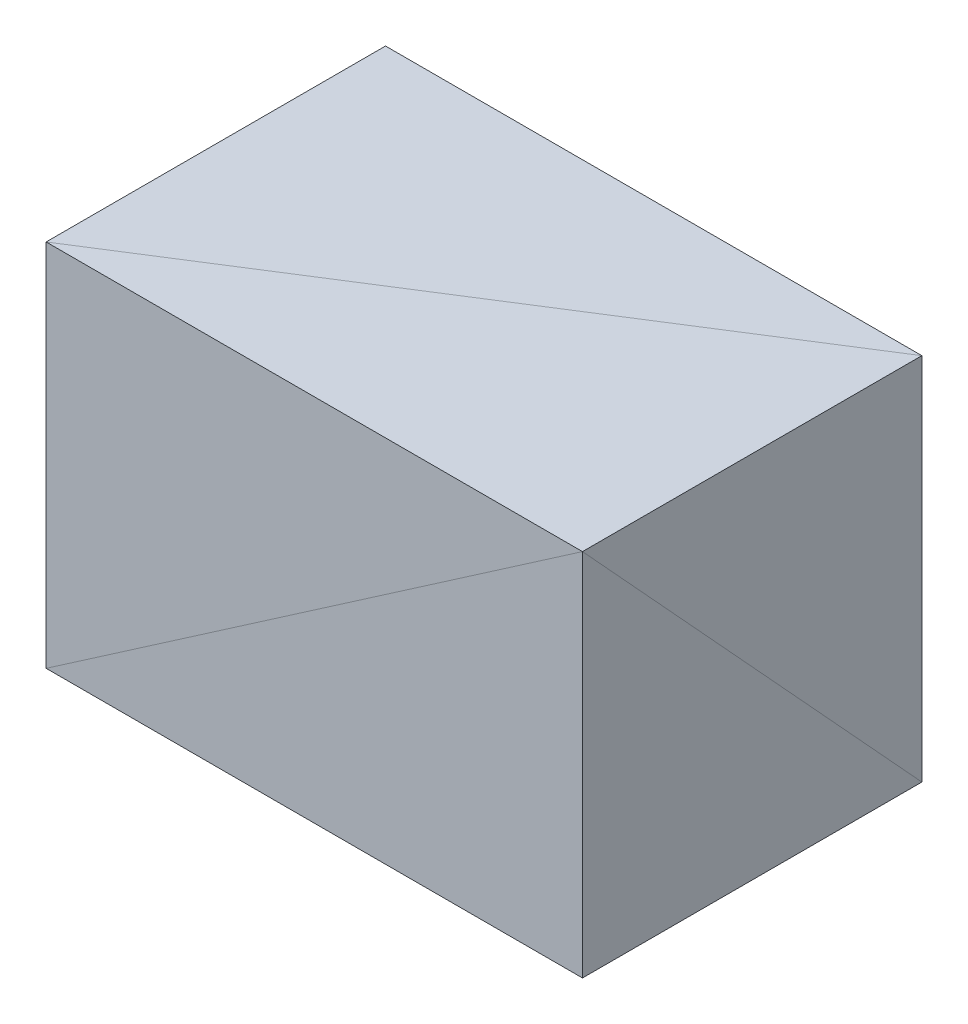
ISO-10303-21;
HEADER;
FILE_DESCRIPTION(('STEP AP214'),'2;1');
FILE_NAME('part.step','',(''),(''),'','','');
FILE_SCHEMA(('AUTOMOTIVE_DESIGN { 1 0 10303 214 1 1 1 1 }'));
ENDSEC;
DATA;
#1=APPLICATION_CONTEXT('core data for automotive mechanical design processes');
#2=APPLICATION_PROTOCOL_DEFINITION('international standard','automotive_design',2000,#1);
#3=PRODUCT_CONTEXT('',#1,'mechanical');
#4=PRODUCT('Part','Part','',(#3));
#5=PRODUCT_RELATED_PRODUCT_CATEGORY('part','',(#4));
#6=PRODUCT_DEFINITION_FORMATION('','',#4);
#7=PRODUCT_DEFINITION_CONTEXT('part definition',#1,'design');
#8=PRODUCT_DEFINITION('design','',#6,#7);
#9=PRODUCT_DEFINITION_SHAPE('','',#8);
#10=(LENGTH_UNIT() NAMED_UNIT(*) SI_UNIT(.MILLI.,.METRE.));
#11=(NAMED_UNIT(*) PLANE_ANGLE_UNIT() SI_UNIT($,.RADIAN.));
#12=(NAMED_UNIT(*) SI_UNIT($,.STERADIAN.) SOLID_ANGLE_UNIT());
#13=UNCERTAINTY_MEASURE_WITH_UNIT(LENGTH_MEASURE(1.E-05),#10,'distance_accuracy_value','');
#14=(GEOMETRIC_REPRESENTATION_CONTEXT(3) GLOBAL_UNCERTAINTY_ASSIGNED_CONTEXT((#13)) GLOBAL_UNIT_ASSIGNED_CONTEXT((#10,
#11,#12)) REPRESENTATION_CONTEXT('',''));
#15=CARTESIAN_POINT('',(0.,0.,0.));
#16=DIRECTION('',(0.,0.,1.));
#17=DIRECTION('',(1.,0.,0.));
#18=AXIS2_PLACEMENT_3D('',#15,#16,#17);
#19=CARTESIAN_POINT('',(-3.633766810099,1.079666694005,4.90299987793));
#20=DIRECTION('',(0.,0.,-1.));
#21=DIRECTION('',(0.,-1.,0.));
#22=AXIS2_PLACEMENT_3D('',#19,#20,#21);
#23=PLANE('',#22);
#24=CARTESIAN_POINT('',(4.113233248393,6.413333257039,4.90299987793));
#25=DIRECTION('',(-1.,0.,0.));
#26=VECTOR('',#25,1.);
#27=LINE('',#24,#26);
#28=CARTESIAN_POINT('',(4.11323324839278,6.41341654459648,4.90299987792983));
#29=VERTEX_POINT('',#28);
#30=CARTESIAN_POINT('',(-3.63376681009914,6.413416544596,4.90299987792978));
#31=VERTEX_POINT('',#30);
#32=EDGE_CURVE('E61',#29,#31,#27,.T.);
#33=ORIENTED_EDGE('',*,*,#32,.T.);
#34=CARTESIAN_POINT('',(-3.633766810099,6.413333257039,4.90299987793));
#35=DIRECTION('',(0.,-1.,0.));
#36=VECTOR('',#35,1.);
#37=LINE('',#34,#36);
#38=CARTESIAN_POINT('',(-3.63376681009878,1.07958336671153,4.90299987792983));
#39=VERTEX_POINT('',#38);
#40=EDGE_CURVE('E65',#31,#39,#37,.T.);
#41=ORIENTED_EDGE('',*,*,#40,.T.);
#42=CARTESIAN_POINT('',(-3.633766810099,1.079666694005,4.90299987793));
#43=DIRECTION('',(0.823664315672861,0.567077679940904,0.));
#44=VECTOR('',#43,1.);
#45=LINE('',#42,#44);
#46=EDGE_CURVE('E58',#39,#29,#45,.T.);
#47=ORIENTED_EDGE('',*,*,#46,.T.);
#48=EDGE_LOOP('',(#33,#41,#47));
#49=FACE_BOUND('',#48,.T.);
#50=ADVANCED_FACE('F16',(#49),#23,.F.);
#51=CARTESIAN_POINT('',(-3.633766810099,1.079666694005,4.90299987793));
#52=DIRECTION('',(0.,0.,-1.));
#53=DIRECTION('',(0.,-1.,0.));
#54=AXIS2_PLACEMENT_3D('',#51,#52,#53);
#55=PLANE('',#54);
#56=CARTESIAN_POINT('',(4.113233248393,1.079666694005,4.90299987793));
#57=DIRECTION('',(0.,1.,0.));
#58=VECTOR('',#57,1.);
#59=LINE('',#56,#58);
#60=CARTESIAN_POINT('',(4.11323324839314,1.079583366712,4.90299987792978));
#61=VERTEX_POINT('',#60);
#62=EDGE_CURVE('E71',#61,#29,#59,.T.);
#63=ORIENTED_EDGE('',*,*,#62,.T.);
#64=ORIENTED_EDGE('',*,*,#46,.F.);
#65=CARTESIAN_POINT('',(-3.633766810099,1.079666694005,4.90299987793));
#66=DIRECTION('',(1.,0.,0.));
#67=VECTOR('',#66,1.);
#68=LINE('',#65,#67);
#69=EDGE_CURVE('E77',#39,#61,#68,.T.);
#70=ORIENTED_EDGE('',*,*,#69,.T.);
#71=EDGE_LOOP('',(#63,#64,#70));
#72=FACE_BOUND('',#71,.T.);
#73=ADVANCED_FACE('F76',(#72),#55,.F.);
#74=CARTESIAN_POINT('',(4.113233248393,1.079500039419,4.90299987793));
#75=DIRECTION('',(-1.,0.,0.));
#76=DIRECTION('',(0.,0.,1.));
#77=AXIS2_PLACEMENT_3D('',#74,#75,#76);
#78=PLANE('',#77);
#79=CARTESIAN_POINT('',(4.113233248393,1.079500039419,0.00100000000869023));
#80=DIRECTION('',(0.,0.736294058048826,0.67666170283384));
#81=VECTOR('',#80,1.);
#82=LINE('',#79,#81);
#83=CARTESIAN_POINT('',(4.113233248393,1.07958336671184,0.00100000000886337));
#84=VERTEX_POINT('',#83);
#85=EDGE_CURVE('E86',#84,#29,#82,.T.);
#86=ORIENTED_EDGE('',*,*,#85,.T.);
#87=ORIENTED_EDGE('',*,*,#62,.F.);
#88=CARTESIAN_POINT('',(4.113233248393,1.079500039419,4.90299987793));
#89=DIRECTION('',(0.,0.,-1.));
#90=VECTOR('',#89,1.);
#91=LINE('',#88,#90);
#92=EDGE_CURVE('E89',#61,#84,#91,.T.);
#93=ORIENTED_EDGE('',*,*,#92,.T.);
#94=EDGE_LOOP('',(#86,#87,#93));
#95=FACE_BOUND('',#94,.T.);
#96=ADVANCED_FACE('F88',(#95),#78,.F.);
#97=CARTESIAN_POINT('',(4.113233248393,6.413499832153,4.90299987793));
#98=DIRECTION('',(0.,-1.,0.));
#99=DIRECTION('',(0.,0.,-1.));
#100=AXIS2_PLACEMENT_3D('',#97,#98,#99);
#101=PLANE('',#100);
#102=CARTESIAN_POINT('',(4.113233248393,6.413499832153,0.00100000000869023));
#103=DIRECTION('',(-0.845037604070773,0.,0.534706880174856));
#104=VECTOR('',#103,1.);
#105=LINE('',#102,#104);
#106=CARTESIAN_POINT('',(4.11323324839293,6.41341654459631,0.00100000000891432));
#107=VERTEX_POINT('',#106);
#108=EDGE_CURVE('E105',#107,#31,#105,.T.);
#109=ORIENTED_EDGE('',*,*,#108,.T.);
#110=ORIENTED_EDGE('',*,*,#32,.F.);
#111=CARTESIAN_POINT('',(4.113233248393,6.413499832153,4.90299987793));
#112=DIRECTION('',(0.,0.,-1.));
#113=VECTOR('',#112,1.);
#114=LINE('',#111,#113);
#115=EDGE_CURVE('E97',#29,#107,#114,.T.);
#116=ORIENTED_EDGE('',*,*,#115,.T.);
#117=EDGE_LOOP('',(#109,#110,#116));
#118=FACE_BOUND('',#117,.T.);
#119=ADVANCED_FACE('F102',(#118),#101,.F.);
#120=CARTESIAN_POINT('',(-3.633766810099,6.413499832153,4.90299987793));
#121=DIRECTION('',(1.,0.,0.));
#122=DIRECTION('',(0.,1.,0.));
#123=AXIS2_PLACEMENT_3D('',#120,#121,#122);
#124=PLANE('',#123);
#125=CARTESIAN_POINT('',(-3.633766810099,6.413499832153,0.00100000000869023));
#126=DIRECTION('',(0.,-0.736294058048826,0.67666170283384));
#127=VECTOR('',#126,1.);
#128=LINE('',#125,#127);
#129=CARTESIAN_POINT('',(-3.633766810099,6.41341654459616,0.00100000000886337));
#130=VERTEX_POINT('',#129);
#131=EDGE_CURVE('E214',#130,#39,#128,.T.);
#132=ORIENTED_EDGE('',*,*,#131,.T.);
#133=ORIENTED_EDGE('',*,*,#40,.F.);
#134=CARTESIAN_POINT('',(-3.633766810099,6.413499832153,4.90299987793));
#135=DIRECTION('',(0.,0.,-1.));
#136=VECTOR('',#135,1.);
#137=LINE('',#134,#136);
#138=EDGE_CURVE('E204',#31,#130,#137,.T.);
#139=ORIENTED_EDGE('',*,*,#138,.T.);
#140=EDGE_LOOP('',(#132,#133,#139));
#141=FACE_BOUND('',#140,.T.);
#142=ADVANCED_FACE('F183',(#141),#124,.F.);
#143=CARTESIAN_POINT('',(-3.633766810099,1.079500039419,4.90299987793));
#144=DIRECTION('',(0.,1.,0.));
#145=DIRECTION('',(1.,0.,0.));
#146=AXIS2_PLACEMENT_3D('',#143,#144,#145);
#147=PLANE('',#146);
#148=CARTESIAN_POINT('',(-3.633766810099,1.079500039419,0.00100000000869023));
#149=DIRECTION('',(0.845037604070773,0.,0.534706880174856));
#150=VECTOR('',#149,1.);
#151=LINE('',#148,#150);
#152=CARTESIAN_POINT('',(-3.63376681009892,1.07958336671168,0.00100000000891432));
#153=VERTEX_POINT('',#152);
#154=EDGE_CURVE('E116',#153,#61,#151,.T.);
#155=ORIENTED_EDGE('',*,*,#154,.T.);
#156=ORIENTED_EDGE('',*,*,#69,.F.);
#157=CARTESIAN_POINT('',(-3.633766810099,1.079500039419,4.90299987793));
#158=DIRECTION('',(0.,0.,-1.));
#159=VECTOR('',#158,1.);
#160=LINE('',#157,#159);
#161=EDGE_CURVE('E36',#39,#153,#160,.T.);
#162=ORIENTED_EDGE('',*,*,#161,.T.);
#163=EDGE_LOOP('',(#155,#156,#162));
#164=FACE_BOUND('',#163,.T.);
#165=ADVANCED_FACE('F135',(#164),#147,.F.);
#166=CARTESIAN_POINT('',(4.113233248393,1.079500039419,0.001000000008692));
#167=DIRECTION('',(-1.,0.,0.));
#168=DIRECTION('',(0.,0.,1.));
#169=AXIS2_PLACEMENT_3D('',#166,#167,#168);
#170=PLANE('',#169);
#171=ORIENTED_EDGE('',*,*,#115,.F.);
#172=ORIENTED_EDGE('',*,*,#85,.F.);
#173=CARTESIAN_POINT('',(4.113233248393,1.079500039419,0.001000000008692));
#174=DIRECTION('',(0.,1.,0.));
#175=VECTOR('',#174,1.);
#176=LINE('',#173,#175);
#177=EDGE_CURVE('E113',#84,#107,#176,.T.);
#178=ORIENTED_EDGE('',*,*,#177,.T.);
#179=EDGE_LOOP('',(#171,#172,#178));
#180=FACE_BOUND('',#179,.T.);
#181=ADVANCED_FACE('F111',(#180),#170,.F.);
#182=CARTESIAN_POINT('',(-3.633766810099,1.079500039419,0.001000000008692));
#183=DIRECTION('',(0.,1.,0.));
#184=DIRECTION('',(1.,0.,0.));
#185=AXIS2_PLACEMENT_3D('',#182,#183,#184);
#186=PLANE('',#185);
#187=ORIENTED_EDGE('',*,*,#92,.F.);
#188=ORIENTED_EDGE('',*,*,#154,.F.);
#189=CARTESIAN_POINT('',(-3.633766810099,1.079500039419,0.001000000008692));
#190=DIRECTION('',(1.,0.,0.));
#191=VECTOR('',#190,1.);
#192=LINE('',#189,#191);
#193=EDGE_CURVE('E228',#153,#84,#192,.T.);
#194=ORIENTED_EDGE('',*,*,#193,.T.);
#195=EDGE_LOOP('',(#187,#188,#194));
#196=FACE_BOUND('',#195,.T.);
#197=ADVANCED_FACE('F134',(#196),#186,.F.);
#198=CARTESIAN_POINT('',(4.113233248393,6.413499832153,0.001000000008692));
#199=DIRECTION('',(0.,-1.,0.));
#200=DIRECTION('',(0.,0.,-1.));
#201=AXIS2_PLACEMENT_3D('',#198,#199,#200);
#202=PLANE('',#201);
#203=ORIENTED_EDGE('',*,*,#138,.F.);
#204=ORIENTED_EDGE('',*,*,#108,.F.);
#205=CARTESIAN_POINT('',(4.113233248393,6.413499832153,0.001000000008692));
#206=DIRECTION('',(-1.,0.,0.));
#207=VECTOR('',#206,1.);
#208=LINE('',#205,#207);
#209=EDGE_CURVE('E219',#107,#130,#208,.T.);
#210=ORIENTED_EDGE('',*,*,#209,.T.);
#211=EDGE_LOOP('',(#203,#204,#210));
#212=FACE_BOUND('',#211,.T.);
#213=ADVANCED_FACE('F221',(#212),#202,.F.);
#214=CARTESIAN_POINT('',(-3.633766810099,6.413499832153,0.001000000008692));
#215=DIRECTION('',(1.,0.,0.));
#216=DIRECTION('',(0.,1.,0.));
#217=AXIS2_PLACEMENT_3D('',#214,#215,#216);
#218=PLANE('',#217);
#219=ORIENTED_EDGE('',*,*,#161,.F.);
#220=ORIENTED_EDGE('',*,*,#131,.F.);
#221=CARTESIAN_POINT('',(-3.633766810099,6.413499832153,0.001000000008692));
#222=DIRECTION('',(0.,-1.,0.));
#223=VECTOR('',#222,1.);
#224=LINE('',#221,#223);
#225=EDGE_CURVE('E28',#130,#153,#224,.T.);
#226=ORIENTED_EDGE('',*,*,#225,.T.);
#227=EDGE_LOOP('',(#219,#220,#226));
#228=FACE_BOUND('',#227,.T.);
#229=ADVANCED_FACE('F234',(#228),#218,.F.);
#230=CARTESIAN_POINT('',(4.113233248393,1.079666694005,0.001000000008692));
#231=DIRECTION('',(0.,0.,1.));
#232=DIRECTION('',(1.,0.,0.));
#233=AXIS2_PLACEMENT_3D('',#230,#231,#232);
#234=PLANE('',#233);
#235=CARTESIAN_POINT('',(-3.633766810099,1.079666694005,0.001000000008692));
#236=DIRECTION('',(0.82366431567286,0.567077679940904,0.));
#237=VECTOR('',#236,1.);
#238=LINE('',#235,#237);
#239=EDGE_CURVE('E11',#153,#107,#238,.T.);
#240=ORIENTED_EDGE('',*,*,#239,.T.);
#241=ORIENTED_EDGE('',*,*,#177,.F.);
#242=ORIENTED_EDGE('',*,*,#193,.F.);
#243=EDGE_LOOP('',(#240,#241,#242));
#244=FACE_BOUND('',#243,.T.);
#245=ADVANCED_FACE('F261',(#244),#234,.F.);
#246=CARTESIAN_POINT('',(4.113233248393,6.413333257039,0.001000000008692));
#247=DIRECTION('',(0.,0.,1.));
#248=DIRECTION('',(1.,0.,0.));
#249=AXIS2_PLACEMENT_3D('',#246,#247,#248);
#250=PLANE('',#249);
#251=ORIENTED_EDGE('',*,*,#225,.F.);
#252=ORIENTED_EDGE('',*,*,#209,.F.);
#253=ORIENTED_EDGE('',*,*,#239,.F.);
#254=EDGE_LOOP('',(#251,#252,#253));
#255=FACE_BOUND('',#254,.T.);
#256=ADVANCED_FACE('F242',(#255),#250,.F.);
#257=CLOSED_SHELL('',(#50,#73,#96,#119,#142,#165,#181,#197,#213,#229,#245,#256));
#258=MANIFOLD_SOLID_BREP('B1',#257);
#259=ADVANCED_BREP_SHAPE_REPRESENTATION('',(#18,#258),#14);
#260=SHAPE_DEFINITION_REPRESENTATION(#9,#259);
ENDSEC;
END-ISO-10303-21;
